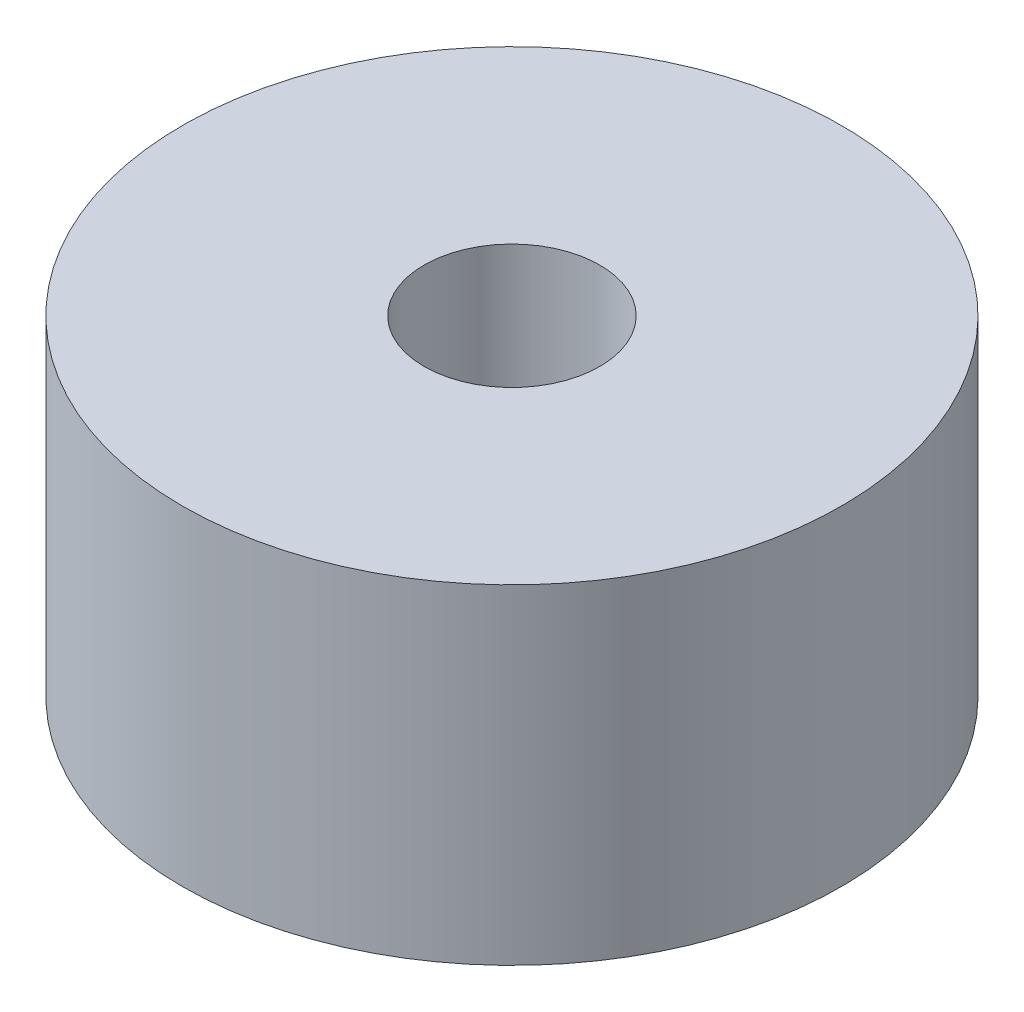
ISO-10303-21;
HEADER;
FILE_DESCRIPTION(('STEP AP214'),'2;1');
FILE_NAME('part.step','',(''),(''),'','','');
FILE_SCHEMA(('AUTOMOTIVE_DESIGN { 1 0 10303 214 1 1 1 1 }'));
ENDSEC;
DATA;
#1=APPLICATION_CONTEXT('core data for automotive mechanical design processes');
#2=APPLICATION_PROTOCOL_DEFINITION('international standard','automotive_design',2000,#1);
#3=PRODUCT_CONTEXT('',#1,'mechanical');
#4=PRODUCT('Part','Part','',(#3));
#5=PRODUCT_RELATED_PRODUCT_CATEGORY('part','',(#4));
#6=PRODUCT_DEFINITION_FORMATION('','',#4);
#7=PRODUCT_DEFINITION_CONTEXT('part definition',#1,'design');
#8=PRODUCT_DEFINITION('design','',#6,#7);
#9=PRODUCT_DEFINITION_SHAPE('','',#8);
#10=(LENGTH_UNIT() NAMED_UNIT(*) SI_UNIT(.MILLI.,.METRE.));
#11=(NAMED_UNIT(*) PLANE_ANGLE_UNIT() SI_UNIT($,.RADIAN.));
#12=(NAMED_UNIT(*) SI_UNIT($,.STERADIAN.) SOLID_ANGLE_UNIT());
#13=UNCERTAINTY_MEASURE_WITH_UNIT(LENGTH_MEASURE(1.E-05),#10,'distance_accuracy_value','');
#14=(GEOMETRIC_REPRESENTATION_CONTEXT(3) GLOBAL_UNCERTAINTY_ASSIGNED_CONTEXT((#13)) GLOBAL_UNIT_ASSIGNED_CONTEXT((#10,
#11,#12)) REPRESENTATION_CONTEXT('',''));
#15=CARTESIAN_POINT('',(0.,0.,0.));
#16=DIRECTION('',(0.,0.,1.));
#17=DIRECTION('',(1.,0.,0.));
#18=AXIS2_PLACEMENT_3D('',#15,#16,#17);
#19=CARTESIAN_POINT('',(0.,15.,0.));
#20=DIRECTION('',(0.,-1.,0.));
#21=DIRECTION('',(0.,0.,-1.));
#22=AXIS2_PLACEMENT_3D('',#19,#20,#21);
#23=CYLINDRICAL_SURFACE('',#22,15.);
#24=CARTESIAN_POINT('',(0.,15.,0.));
#25=DIRECTION('',(0.,1.,0.));
#26=DIRECTION('',(0.,0.,1.));
#27=AXIS2_PLACEMENT_3D('',#24,#25,#26);
#28=CIRCLE('',#27,15.);
#29=CARTESIAN_POINT('',(0.,15.,15.));
#30=VERTEX_POINT('',#29);
#31=EDGE_CURVE('E10',#30,#30,#28,.T.);
#32=ORIENTED_EDGE('',*,*,#31,.F.);
#33=EDGE_LOOP('',(#32));
#34=FACE_BOUND('',#33,.T.);
#35=CARTESIAN_POINT('',(0.,0.,0.));
#36=DIRECTION('',(0.,1.,0.));
#37=DIRECTION('',(0.,0.,1.));
#38=AXIS2_PLACEMENT_3D('',#35,#36,#37);
#39=CIRCLE('',#38,15.);
#40=CARTESIAN_POINT('',(0.,0.,15.));
#41=VERTEX_POINT('',#40);
#42=EDGE_CURVE('E48',#41,#41,#39,.T.);
#43=ORIENTED_EDGE('',*,*,#42,.T.);
#44=EDGE_LOOP('',(#43));
#45=FACE_BOUND('',#44,.T.);
#46=ADVANCED_FACE('F45',(#34,#45),#23,.T.);
#47=CARTESIAN_POINT('',(0.,15.,0.));
#48=DIRECTION('',(0.,1.,0.));
#49=DIRECTION('',(0.,0.,1.));
#50=AXIS2_PLACEMENT_3D('',#47,#48,#49);
#51=PLANE('',#50);
#52=CARTESIAN_POINT('',(0.,15.,0.));
#53=DIRECTION('',(0.,1.,0.));
#54=DIRECTION('',(0.,0.,1.));
#55=AXIS2_PLACEMENT_3D('',#52,#53,#54);
#56=CIRCLE('',#55,4.);
#57=CARTESIAN_POINT('',(0.,15.,4.));
#58=VERTEX_POINT('',#57);
#59=EDGE_CURVE('E59',#58,#58,#56,.T.);
#60=ORIENTED_EDGE('',*,*,#59,.F.);
#61=EDGE_LOOP('',(#60));
#62=FACE_BOUND('',#61,.T.);
#63=ORIENTED_EDGE('',*,*,#31,.T.);
#64=EDGE_LOOP('',(#63));
#65=FACE_BOUND('',#64,.T.);
#66=ADVANCED_FACE('F76',(#62,#65),#51,.T.);
#67=CARTESIAN_POINT('',(0.,0.,0.));
#68=DIRECTION('',(0.,1.,0.));
#69=DIRECTION('',(0.,0.,1.));
#70=AXIS2_PLACEMENT_3D('',#67,#68,#69);
#71=PLANE('',#70);
#72=ORIENTED_EDGE('',*,*,#42,.F.);
#73=EDGE_LOOP('',(#72));
#74=FACE_BOUND('',#73,.T.);
#75=ADVANCED_FACE('F72',(#74),#71,.F.);
#76=CARTESIAN_POINT('',(0.,5.,0.));
#77=DIRECTION('',(0.,1.,0.));
#78=DIRECTION('',(0.,0.,1.));
#79=AXIS2_PLACEMENT_3D('',#76,#77,#78);
#80=CYLINDRICAL_SURFACE('',#79,4.);
#81=CARTESIAN_POINT('',(0.,5.,0.));
#82=DIRECTION('',(0.,1.,0.));
#83=DIRECTION('',(0.,0.,1.));
#84=AXIS2_PLACEMENT_3D('',#81,#82,#83);
#85=CIRCLE('',#84,4.);
#86=CARTESIAN_POINT('',(0.,5.,4.));
#87=VERTEX_POINT('',#86);
#88=EDGE_CURVE('E57',#87,#87,#85,.T.);
#89=ORIENTED_EDGE('',*,*,#88,.F.);
#90=EDGE_LOOP('',(#89));
#91=FACE_BOUND('',#90,.T.);
#92=ORIENTED_EDGE('',*,*,#59,.T.);
#93=EDGE_LOOP('',(#92));
#94=FACE_BOUND('',#93,.T.);
#95=ADVANCED_FACE('F69',(#91,#94),#80,.F.);
#96=CARTESIAN_POINT('',(0.,5.,0.));
#97=DIRECTION('',(0.,1.,0.));
#98=DIRECTION('',(0.,0.,1.));
#99=AXIS2_PLACEMENT_3D('',#96,#97,#98);
#100=PLANE('',#99);
#101=ORIENTED_EDGE('',*,*,#88,.T.);
#102=EDGE_LOOP('',(#101));
#103=FACE_BOUND('',#102,.T.);
#104=ADVANCED_FACE('F67',(#103),#100,.T.);
#105=CLOSED_SHELL('',(#46,#66,#75,#95,#104));
#106=MANIFOLD_SOLID_BREP('B2',#105);
#107=ADVANCED_BREP_SHAPE_REPRESENTATION('',(#18,#106),#14);
#108=SHAPE_DEFINITION_REPRESENTATION(#9,#107);
ENDSEC;
END-ISO-10303-21;
